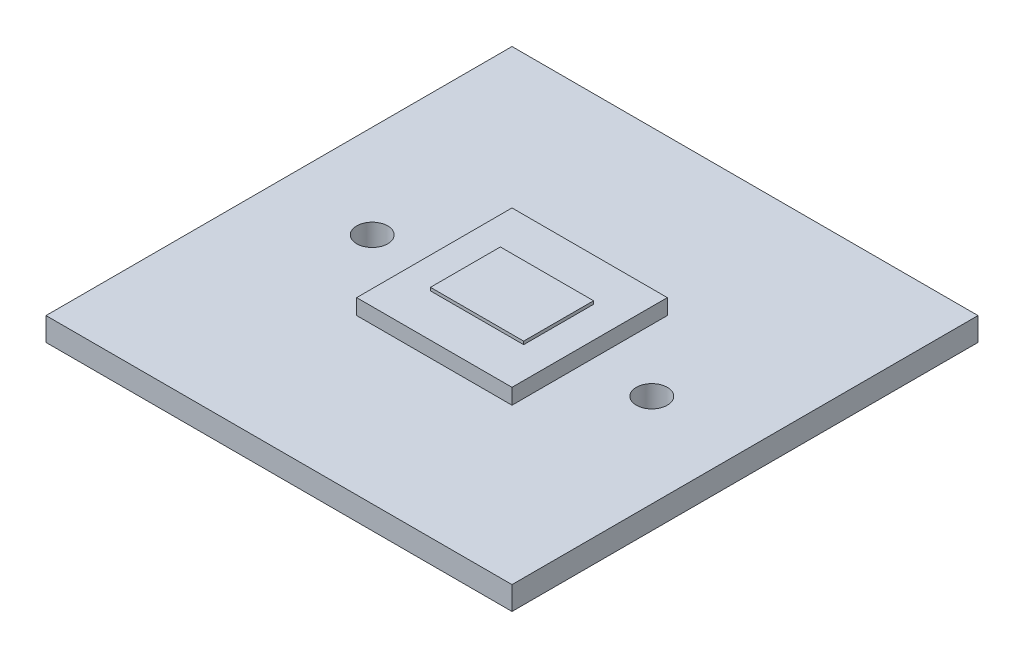
ISO-10303-21;
HEADER;
FILE_DESCRIPTION(('STEP AP214'),'2;1');
FILE_NAME('part.step','',(''),(''),'','','');
FILE_SCHEMA(('AUTOMOTIVE_DESIGN { 1 0 10303 214 1 1 1 1 }'));
ENDSEC;
DATA;
#1=APPLICATION_CONTEXT('core data for automotive mechanical design processes');
#2=APPLICATION_PROTOCOL_DEFINITION('international standard','automotive_design',2000,#1);
#3=PRODUCT_CONTEXT('',#1,'mechanical');
#4=PRODUCT('Part','Part','',(#3));
#5=PRODUCT_RELATED_PRODUCT_CATEGORY('part','',(#4));
#6=PRODUCT_DEFINITION_FORMATION('','',#4);
#7=PRODUCT_DEFINITION_CONTEXT('part definition',#1,'design');
#8=PRODUCT_DEFINITION('design','',#6,#7);
#9=PRODUCT_DEFINITION_SHAPE('','',#8);
#10=(LENGTH_UNIT() NAMED_UNIT(*) SI_UNIT(.MILLI.,.METRE.));
#11=(NAMED_UNIT(*) PLANE_ANGLE_UNIT() SI_UNIT($,.RADIAN.));
#12=(NAMED_UNIT(*) SI_UNIT($,.STERADIAN.) SOLID_ANGLE_UNIT());
#13=UNCERTAINTY_MEASURE_WITH_UNIT(LENGTH_MEASURE(1.E-05),#10,'distance_accuracy_value','');
#14=(GEOMETRIC_REPRESENTATION_CONTEXT(3) GLOBAL_UNCERTAINTY_ASSIGNED_CONTEXT((#13)) GLOBAL_UNIT_ASSIGNED_CONTEXT((#10,
#11,#12)) REPRESENTATION_CONTEXT('',''));
#15=CARTESIAN_POINT('',(0.,0.,0.));
#16=DIRECTION('',(0.,0.,1.));
#17=DIRECTION('',(1.,0.,0.));
#18=AXIS2_PLACEMENT_3D('',#15,#16,#17);
#19=CARTESIAN_POINT('',(0.,1.,0.));
#20=DIRECTION('',(0.,-1.,0.));
#21=DIRECTION('',(0.,0.,-1.));
#22=AXIS2_PLACEMENT_3D('',#19,#20,#21);
#23=PLANE('',#22);
#24=DIRECTION('',(0.,0.,-1.));
#25=VECTOR('',#24,1.);
#26=CARTESIAN_POINT('',(5.,1.,5.));
#27=LINE('',#26,#25);
#28=CARTESIAN_POINT('',(5.,1.,5.));
#29=VERTEX_POINT('',#28);
#30=CARTESIAN_POINT('',(5.,1.,-5.));
#31=VERTEX_POINT('',#30);
#32=EDGE_CURVE('E183',#29,#31,#27,.T.);
#33=ORIENTED_EDGE('',*,*,#32,.T.);
#34=DIRECTION('',(-1.,0.,0.));
#35=VECTOR('',#34,1.);
#36=CARTESIAN_POINT('',(-5.,1.,-5.));
#37=LINE('',#36,#35);
#38=CARTESIAN_POINT('',(-5.,1.,-5.));
#39=VERTEX_POINT('',#38);
#40=EDGE_CURVE('E186',#31,#39,#37,.T.);
#41=ORIENTED_EDGE('',*,*,#40,.T.);
#42=DIRECTION('',(0.,0.,1.));
#43=VECTOR('',#42,1.);
#44=CARTESIAN_POINT('',(-5.,1.,5.));
#45=LINE('',#44,#43);
#46=CARTESIAN_POINT('',(-5.,1.,5.));
#47=VERTEX_POINT('',#46);
#48=EDGE_CURVE('E189',#39,#47,#45,.T.);
#49=ORIENTED_EDGE('',*,*,#48,.T.);
#50=DIRECTION('',(1.,0.,0.));
#51=VECTOR('',#50,1.);
#52=CARTESIAN_POINT('',(-5.,1.,5.));
#53=LINE('',#52,#51);
#54=EDGE_CURVE('E191',#47,#29,#53,.T.);
#55=ORIENTED_EDGE('',*,*,#54,.T.);
#56=EDGE_LOOP('',(#33,#41,#49,#55));
#57=FACE_BOUND('',#56,.T.);
#58=DIRECTION('',(0.,0.,-1.));
#59=VECTOR('',#58,1.);
#60=CARTESIAN_POINT('',(3.,1.,2.25));
#61=LINE('',#60,#59);
#62=CARTESIAN_POINT('',(3.,1.,2.25));
#63=VERTEX_POINT('',#62);
#64=CARTESIAN_POINT('',(3.,1.,-2.25));
#65=VERTEX_POINT('',#64);
#66=EDGE_CURVE('E149',#63,#65,#61,.T.);
#67=ORIENTED_EDGE('',*,*,#66,.F.);
#68=DIRECTION('',(1.,0.,0.));
#69=VECTOR('',#68,1.);
#70=CARTESIAN_POINT('',(-3.,1.,2.25));
#71=LINE('',#70,#69);
#72=CARTESIAN_POINT('',(-3.,1.,2.25));
#73=VERTEX_POINT('',#72);
#74=EDGE_CURVE('E161',#73,#63,#71,.T.);
#75=ORIENTED_EDGE('',*,*,#74,.F.);
#76=DIRECTION('',(0.,0.,1.));
#77=VECTOR('',#76,1.);
#78=CARTESIAN_POINT('',(-3.,1.,2.25));
#79=LINE('',#78,#77);
#80=CARTESIAN_POINT('',(-3.,1.,-2.25));
#81=VERTEX_POINT('',#80);
#82=EDGE_CURVE('E57',#81,#73,#79,.T.);
#83=ORIENTED_EDGE('',*,*,#82,.F.);
#84=DIRECTION('',(-1.,0.,0.));
#85=VECTOR('',#84,1.);
#86=CARTESIAN_POINT('',(-3.,1.,-2.25));
#87=LINE('',#86,#85);
#88=EDGE_CURVE('E52',#65,#81,#87,.T.);
#89=ORIENTED_EDGE('',*,*,#88,.F.);
#90=EDGE_LOOP('',(#67,#75,#83,#89));
#91=FACE_BOUND('',#90,.T.);
#92=ADVANCED_FACE('F37',(#57,#91),#23,.F.);
#93=CARTESIAN_POINT('',(5.,1.,5.));
#94=DIRECTION('',(-1.,0.,0.));
#95=DIRECTION('',(0.,0.,1.));
#96=AXIS2_PLACEMENT_3D('',#93,#94,#95);
#97=PLANE('',#96);
#98=DIRECTION('',(0.,0.,-1.));
#99=VECTOR('',#98,1.);
#100=CARTESIAN_POINT('',(5.,0.,5.));
#101=LINE('',#100,#99);
#102=CARTESIAN_POINT('',(5.,0.,5.));
#103=VERTEX_POINT('',#102);
#104=CARTESIAN_POINT('',(5.,0.,-5.));
#105=VERTEX_POINT('',#104);
#106=EDGE_CURVE('E182',#103,#105,#101,.T.);
#107=ORIENTED_EDGE('',*,*,#106,.T.);
#108=DIRECTION('',(0.,-1.,0.));
#109=VECTOR('',#108,1.);
#110=CARTESIAN_POINT('',(5.,1.,-5.));
#111=LINE('',#110,#109);
#112=EDGE_CURVE('E11',#31,#105,#111,.T.);
#113=ORIENTED_EDGE('',*,*,#112,.F.);
#114=ORIENTED_EDGE('',*,*,#32,.F.);
#115=DIRECTION('',(0.,-1.,0.));
#116=VECTOR('',#115,1.);
#117=CARTESIAN_POINT('',(5.,1.,5.));
#118=LINE('',#117,#116);
#119=EDGE_CURVE('E193',#29,#103,#118,.T.);
#120=ORIENTED_EDGE('',*,*,#119,.T.);
#121=EDGE_LOOP('',(#107,#113,#114,#120));
#122=FACE_BOUND('',#121,.T.);
#123=ADVANCED_FACE('F39',(#122),#97,.F.);
#124=CARTESIAN_POINT('',(-5.,1.,-5.));
#125=DIRECTION('',(0.,0.,1.));
#126=DIRECTION('',(1.,0.,0.));
#127=AXIS2_PLACEMENT_3D('',#124,#125,#126);
#128=PLANE('',#127);
#129=DIRECTION('',(-1.,0.,0.));
#130=VECTOR('',#129,1.);
#131=CARTESIAN_POINT('',(-5.,0.,-5.));
#132=LINE('',#131,#130);
#133=CARTESIAN_POINT('',(-5.,0.,-5.));
#134=VERTEX_POINT('',#133);
#135=EDGE_CURVE('E196',#105,#134,#132,.T.);
#136=ORIENTED_EDGE('',*,*,#135,.T.);
#137=DIRECTION('',(0.,-1.,0.));
#138=VECTOR('',#137,1.);
#139=CARTESIAN_POINT('',(-5.,1.,-5.));
#140=LINE('',#139,#138);
#141=EDGE_CURVE('E45',#39,#134,#140,.T.);
#142=ORIENTED_EDGE('',*,*,#141,.F.);
#143=ORIENTED_EDGE('',*,*,#40,.F.);
#144=ORIENTED_EDGE('',*,*,#112,.T.);
#145=EDGE_LOOP('',(#136,#142,#143,#144));
#146=FACE_BOUND('',#145,.T.);
#147=ADVANCED_FACE('F215',(#146),#128,.F.);
#148=CARTESIAN_POINT('',(-5.,1.,5.));
#149=DIRECTION('',(1.,0.,0.));
#150=DIRECTION('',(0.,0.,-1.));
#151=AXIS2_PLACEMENT_3D('',#148,#149,#150);
#152=PLANE('',#151);
#153=DIRECTION('',(0.,0.,1.));
#154=VECTOR('',#153,1.);
#155=CARTESIAN_POINT('',(-5.,0.,5.));
#156=LINE('',#155,#154);
#157=CARTESIAN_POINT('',(-5.,0.,5.));
#158=VERTEX_POINT('',#157);
#159=EDGE_CURVE('E199',#134,#158,#156,.T.);
#160=ORIENTED_EDGE('',*,*,#159,.T.);
#161=DIRECTION('',(0.,-1.,0.));
#162=VECTOR('',#161,1.);
#163=CARTESIAN_POINT('',(-5.,1.,5.));
#164=LINE('',#163,#162);
#165=EDGE_CURVE('E206',#47,#158,#164,.T.);
#166=ORIENTED_EDGE('',*,*,#165,.F.);
#167=ORIENTED_EDGE('',*,*,#48,.F.);
#168=ORIENTED_EDGE('',*,*,#141,.T.);
#169=EDGE_LOOP('',(#160,#166,#167,#168));
#170=FACE_BOUND('',#169,.T.);
#171=ADVANCED_FACE('F212',(#170),#152,.F.);
#172=CARTESIAN_POINT('',(-5.,1.,5.));
#173=DIRECTION('',(0.,0.,-1.));
#174=DIRECTION('',(-1.,0.,0.));
#175=AXIS2_PLACEMENT_3D('',#172,#173,#174);
#176=PLANE('',#175);
#177=DIRECTION('',(1.,0.,0.));
#178=VECTOR('',#177,1.);
#179=CARTESIAN_POINT('',(-5.,0.,5.));
#180=LINE('',#179,#178);
#181=EDGE_CURVE('E187',#158,#103,#180,.T.);
#182=ORIENTED_EDGE('',*,*,#181,.T.);
#183=ORIENTED_EDGE('',*,*,#119,.F.);
#184=ORIENTED_EDGE('',*,*,#54,.F.);
#185=ORIENTED_EDGE('',*,*,#165,.T.);
#186=EDGE_LOOP('',(#182,#183,#184,#185));
#187=FACE_BOUND('',#186,.T.);
#188=ADVANCED_FACE('F221',(#187),#176,.F.);
#189=CARTESIAN_POINT('',(3.,1.2,2.25));
#190=DIRECTION('',(-1.,0.,0.));
#191=DIRECTION('',(0.,0.,1.));
#192=AXIS2_PLACEMENT_3D('',#189,#190,#191);
#193=PLANE('',#192);
#194=ORIENTED_EDGE('',*,*,#66,.T.);
#195=DIRECTION('',(0.,-1.,0.));
#196=VECTOR('',#195,1.);
#197=CARTESIAN_POINT('',(3.,1.2,-2.25));
#198=LINE('',#197,#196);
#199=CARTESIAN_POINT('',(3.,1.2,-2.25));
#200=VERTEX_POINT('',#199);
#201=EDGE_CURVE('E180',#200,#65,#198,.T.);
#202=ORIENTED_EDGE('',*,*,#201,.F.);
#203=DIRECTION('',(0.,0.,-1.));
#204=VECTOR('',#203,1.);
#205=CARTESIAN_POINT('',(3.,1.2,2.25));
#206=LINE('',#205,#204);
#207=CARTESIAN_POINT('',(3.,1.2,2.25));
#208=VERTEX_POINT('',#207);
#209=EDGE_CURVE('E157',#208,#200,#206,.T.);
#210=ORIENTED_EDGE('',*,*,#209,.F.);
#211=DIRECTION('',(0.,-1.,0.));
#212=VECTOR('',#211,1.);
#213=CARTESIAN_POINT('',(3.,1.2,2.25));
#214=LINE('',#213,#212);
#215=EDGE_CURVE('E166',#208,#63,#214,.T.);
#216=ORIENTED_EDGE('',*,*,#215,.T.);
#217=EDGE_LOOP('',(#194,#202,#210,#216));
#218=FACE_BOUND('',#217,.T.);
#219=ADVANCED_FACE('F236',(#218),#193,.F.);
#220=CARTESIAN_POINT('',(-3.,1.2,-2.25));
#221=DIRECTION('',(0.,0.,1.));
#222=DIRECTION('',(1.,0.,0.));
#223=AXIS2_PLACEMENT_3D('',#220,#221,#222);
#224=PLANE('',#223);
#225=ORIENTED_EDGE('',*,*,#88,.T.);
#226=DIRECTION('',(0.,-1.,0.));
#227=VECTOR('',#226,1.);
#228=CARTESIAN_POINT('',(-3.,1.2,-2.25));
#229=LINE('',#228,#227);
#230=CARTESIAN_POINT('',(-3.,1.2,-2.25));
#231=VERTEX_POINT('',#230);
#232=EDGE_CURVE('E177',#231,#81,#229,.T.);
#233=ORIENTED_EDGE('',*,*,#232,.F.);
#234=DIRECTION('',(-1.,0.,0.));
#235=VECTOR('',#234,1.);
#236=CARTESIAN_POINT('',(-3.,1.2,-2.25));
#237=LINE('',#236,#235);
#238=EDGE_CURVE('E160',#200,#231,#237,.T.);
#239=ORIENTED_EDGE('',*,*,#238,.F.);
#240=ORIENTED_EDGE('',*,*,#201,.T.);
#241=EDGE_LOOP('',(#225,#233,#239,#240));
#242=FACE_BOUND('',#241,.T.);
#243=ADVANCED_FACE('F244',(#242),#224,.F.);
#244=CARTESIAN_POINT('',(-3.,1.2,2.25));
#245=DIRECTION('',(1.,0.,0.));
#246=DIRECTION('',(0.,0.,-1.));
#247=AXIS2_PLACEMENT_3D('',#244,#245,#246);
#248=PLANE('',#247);
#249=ORIENTED_EDGE('',*,*,#82,.T.);
#250=DIRECTION('',(0.,-1.,0.));
#251=VECTOR('',#250,1.);
#252=CARTESIAN_POINT('',(-3.,1.2,2.25));
#253=LINE('',#252,#251);
#254=CARTESIAN_POINT('',(-3.,1.2,2.25));
#255=VERTEX_POINT('',#254);
#256=EDGE_CURVE('E174',#255,#73,#253,.T.);
#257=ORIENTED_EDGE('',*,*,#256,.F.);
#258=DIRECTION('',(0.,0.,1.));
#259=VECTOR('',#258,1.);
#260=CARTESIAN_POINT('',(-3.,1.2,2.25));
#261=LINE('',#260,#259);
#262=EDGE_CURVE('E163',#231,#255,#261,.T.);
#263=ORIENTED_EDGE('',*,*,#262,.F.);
#264=ORIENTED_EDGE('',*,*,#232,.T.);
#265=EDGE_LOOP('',(#249,#257,#263,#264));
#266=FACE_BOUND('',#265,.T.);
#267=ADVANCED_FACE('F242',(#266),#248,.F.);
#268=CARTESIAN_POINT('',(-3.,1.2,2.25));
#269=DIRECTION('',(0.,0.,-1.));
#270=DIRECTION('',(-1.,0.,0.));
#271=AXIS2_PLACEMENT_3D('',#268,#269,#270);
#272=PLANE('',#271);
#273=ORIENTED_EDGE('',*,*,#74,.T.);
#274=ORIENTED_EDGE('',*,*,#215,.F.);
#275=DIRECTION('',(1.,0.,0.));
#276=VECTOR('',#275,1.);
#277=CARTESIAN_POINT('',(-3.,1.2,2.25));
#278=LINE('',#277,#276);
#279=EDGE_CURVE('E165',#255,#208,#278,.T.);
#280=ORIENTED_EDGE('',*,*,#279,.F.);
#281=ORIENTED_EDGE('',*,*,#256,.T.);
#282=EDGE_LOOP('',(#273,#274,#280,#281));
#283=FACE_BOUND('',#282,.T.);
#284=ADVANCED_FACE('F232',(#283),#272,.F.);
#285=CARTESIAN_POINT('',(0.,1.2,0.));
#286=DIRECTION('',(0.,-1.,0.));
#287=DIRECTION('',(0.,0.,-1.));
#288=AXIS2_PLACEMENT_3D('',#285,#286,#287);
#289=PLANE('',#288);
#290=ORIENTED_EDGE('',*,*,#209,.T.);
#291=ORIENTED_EDGE('',*,*,#238,.T.);
#292=ORIENTED_EDGE('',*,*,#262,.T.);
#293=ORIENTED_EDGE('',*,*,#279,.T.);
#294=EDGE_LOOP('',(#290,#291,#292,#293));
#295=FACE_BOUND('',#294,.T.);
#296=ADVANCED_FACE('F238',(#295),#289,.F.);
#297=CARTESIAN_POINT('',(0.,0.,0.));
#298=DIRECTION('',(0.,-1.,0.));
#299=DIRECTION('',(0.,0.,-1.));
#300=AXIS2_PLACEMENT_3D('',#297,#298,#299);
#301=PLANE('',#300);
#302=CARTESIAN_POINT('',(-9.,0.,0.));
#303=DIRECTION('',(0.,1.,0.));
#304=DIRECTION('',(0.,0.,1.));
#305=AXIS2_PLACEMENT_3D('',#302,#303,#304);
#306=CIRCLE('',#305,1.);
#307=CARTESIAN_POINT('',(-9.,0.,1.));
#308=VERTEX_POINT('',#307);
#309=EDGE_CURVE('E409',#308,#308,#306,.T.);
#310=ORIENTED_EDGE('',*,*,#309,.F.);
#311=EDGE_LOOP('',(#310));
#312=FACE_BOUND('',#311,.T.);
#313=CARTESIAN_POINT('',(9.,0.,0.));
#314=DIRECTION('',(0.,1.,0.));
#315=DIRECTION('',(0.,0.,1.));
#316=AXIS2_PLACEMENT_3D('',#313,#314,#315);
#317=CIRCLE('',#316,1.);
#318=CARTESIAN_POINT('',(9.,0.,1.));
#319=VERTEX_POINT('',#318);
#320=EDGE_CURVE('E411',#319,#319,#317,.T.);
#321=ORIENTED_EDGE('',*,*,#320,.F.);
#322=EDGE_LOOP('',(#321));
#323=FACE_BOUND('',#322,.T.);
#324=DIRECTION('',(0.,0.,1.));
#325=VECTOR('',#324,1.);
#326=CARTESIAN_POINT('',(15.,0.,15.));
#327=LINE('',#326,#325);
#328=CARTESIAN_POINT('',(15.,0.,-15.));
#329=VERTEX_POINT('',#328);
#330=CARTESIAN_POINT('',(15.,0.,15.));
#331=VERTEX_POINT('',#330);
#332=EDGE_CURVE('E148',#329,#331,#327,.T.);
#333=ORIENTED_EDGE('',*,*,#332,.F.);
#334=DIRECTION('',(1.,0.,0.));
#335=VECTOR('',#334,1.);
#336=CARTESIAN_POINT('',(-15.,0.,-15.));
#337=LINE('',#336,#335);
#338=CARTESIAN_POINT('',(-15.,0.,-15.));
#339=VERTEX_POINT('',#338);
#340=EDGE_CURVE('E144',#339,#329,#337,.T.);
#341=ORIENTED_EDGE('',*,*,#340,.F.);
#342=DIRECTION('',(0.,0.,-1.));
#343=VECTOR('',#342,1.);
#344=CARTESIAN_POINT('',(-15.,0.,15.));
#345=LINE('',#344,#343);
#346=CARTESIAN_POINT('',(-15.,0.,15.));
#347=VERTEX_POINT('',#346);
#348=EDGE_CURVE('E425',#347,#339,#345,.T.);
#349=ORIENTED_EDGE('',*,*,#348,.F.);
#350=DIRECTION('',(-1.,0.,0.));
#351=VECTOR('',#350,1.);
#352=CARTESIAN_POINT('',(-15.,0.,15.));
#353=LINE('',#352,#351);
#354=EDGE_CURVE('E423',#331,#347,#353,.T.);
#355=ORIENTED_EDGE('',*,*,#354,.F.);
#356=EDGE_LOOP('',(#333,#341,#349,#355));
#357=FACE_BOUND('',#356,.T.);
#358=ORIENTED_EDGE('',*,*,#135,.F.);
#359=ORIENTED_EDGE('',*,*,#106,.F.);
#360=ORIENTED_EDGE('',*,*,#181,.F.);
#361=ORIENTED_EDGE('',*,*,#159,.F.);
#362=EDGE_LOOP('',(#358,#359,#360,#361));
#363=FACE_BOUND('',#362,.T.);
#364=ADVANCED_FACE('F218',(#312,#323,#357,#363),#301,.F.);
#365=CARTESIAN_POINT('',(15.,-1.5,15.));
#366=DIRECTION('',(-1.,0.,0.));
#367=DIRECTION('',(0.,0.,1.));
#368=AXIS2_PLACEMENT_3D('',#365,#366,#367);
#369=PLANE('',#368);
#370=ORIENTED_EDGE('',*,*,#332,.T.);
#371=DIRECTION('',(0.,1.,0.));
#372=VECTOR('',#371,1.);
#373=CARTESIAN_POINT('',(15.,-1.5,15.));
#374=LINE('',#373,#372);
#375=CARTESIAN_POINT('',(15.,-1.5,15.));
#376=VERTEX_POINT('',#375);
#377=EDGE_CURVE('E128',#376,#331,#374,.T.);
#378=ORIENTED_EDGE('',*,*,#377,.F.);
#379=DIRECTION('',(0.,0.,1.));
#380=VECTOR('',#379,1.);
#381=CARTESIAN_POINT('',(15.,-1.5,15.));
#382=LINE('',#381,#380);
#383=CARTESIAN_POINT('',(15.,-1.5,-15.));
#384=VERTEX_POINT('',#383);
#385=EDGE_CURVE('E135',#384,#376,#382,.T.);
#386=ORIENTED_EDGE('',*,*,#385,.F.);
#387=DIRECTION('',(0.,1.,0.));
#388=VECTOR('',#387,1.);
#389=CARTESIAN_POINT('',(15.,-1.5,-15.));
#390=LINE('',#389,#388);
#391=EDGE_CURVE('E421',#384,#329,#390,.T.);
#392=ORIENTED_EDGE('',*,*,#391,.T.);
#393=EDGE_LOOP('',(#370,#378,#386,#392));
#394=FACE_BOUND('',#393,.T.);
#395=ADVANCED_FACE('F146',(#394),#369,.F.);
#396=CARTESIAN_POINT('',(-15.,-1.5,15.));
#397=DIRECTION('',(0.,0.,-1.));
#398=DIRECTION('',(-1.,0.,0.));
#399=AXIS2_PLACEMENT_3D('',#396,#397,#398);
#400=PLANE('',#399);
#401=ORIENTED_EDGE('',*,*,#354,.T.);
#402=DIRECTION('',(0.,1.,0.));
#403=VECTOR('',#402,1.);
#404=CARTESIAN_POINT('',(-15.,-1.5,15.));
#405=LINE('',#404,#403);
#406=CARTESIAN_POINT('',(-15.,-1.5,15.));
#407=VERTEX_POINT('',#406);
#408=EDGE_CURVE('E131',#407,#347,#405,.T.);
#409=ORIENTED_EDGE('',*,*,#408,.F.);
#410=DIRECTION('',(-1.,0.,0.));
#411=VECTOR('',#410,1.);
#412=CARTESIAN_POINT('',(-15.,-1.5,15.));
#413=LINE('',#412,#411);
#414=EDGE_CURVE('E124',#376,#407,#413,.T.);
#415=ORIENTED_EDGE('',*,*,#414,.F.);
#416=ORIENTED_EDGE('',*,*,#377,.T.);
#417=EDGE_LOOP('',(#401,#409,#415,#416));
#418=FACE_BOUND('',#417,.T.);
#419=ADVANCED_FACE('F126',(#418),#400,.F.);
#420=CARTESIAN_POINT('',(-15.,-1.5,15.));
#421=DIRECTION('',(1.,0.,0.));
#422=DIRECTION('',(0.,0.,-1.));
#423=AXIS2_PLACEMENT_3D('',#420,#421,#422);
#424=PLANE('',#423);
#425=ORIENTED_EDGE('',*,*,#348,.T.);
#426=DIRECTION('',(0.,1.,0.));
#427=VECTOR('',#426,1.);
#428=CARTESIAN_POINT('',(-15.,-1.5,-15.));
#429=LINE('',#428,#427);
#430=CARTESIAN_POINT('',(-15.,-1.5,-15.));
#431=VERTEX_POINT('',#430);
#432=EDGE_CURVE('E153',#431,#339,#429,.T.);
#433=ORIENTED_EDGE('',*,*,#432,.F.);
#434=DIRECTION('',(0.,0.,-1.));
#435=VECTOR('',#434,1.);
#436=CARTESIAN_POINT('',(-15.,-1.5,15.));
#437=LINE('',#436,#435);
#438=EDGE_CURVE('E134',#407,#431,#437,.T.);
#439=ORIENTED_EDGE('',*,*,#438,.F.);
#440=ORIENTED_EDGE('',*,*,#408,.T.);
#441=EDGE_LOOP('',(#425,#433,#439,#440));
#442=FACE_BOUND('',#441,.T.);
#443=ADVANCED_FACE('F311',(#442),#424,.F.);
#444=CARTESIAN_POINT('',(-15.,-1.5,-15.));
#445=DIRECTION('',(0.,0.,1.));
#446=DIRECTION('',(1.,0.,0.));
#447=AXIS2_PLACEMENT_3D('',#444,#445,#446);
#448=PLANE('',#447);
#449=ORIENTED_EDGE('',*,*,#340,.T.);
#450=ORIENTED_EDGE('',*,*,#391,.F.);
#451=DIRECTION('',(1.,0.,0.));
#452=VECTOR('',#451,1.);
#453=CARTESIAN_POINT('',(-15.,-1.5,-15.));
#454=LINE('',#453,#452);
#455=EDGE_CURVE('E140',#431,#384,#454,.T.);
#456=ORIENTED_EDGE('',*,*,#455,.F.);
#457=ORIENTED_EDGE('',*,*,#432,.T.);
#458=EDGE_LOOP('',(#449,#450,#456,#457));
#459=FACE_BOUND('',#458,.T.);
#460=ADVANCED_FACE('F318',(#459),#448,.F.);
#461=CARTESIAN_POINT('',(0.,-1.5,0.));
#462=DIRECTION('',(0.,-1.,0.));
#463=DIRECTION('',(0.,0.,-1.));
#464=AXIS2_PLACEMENT_3D('',#461,#462,#463);
#465=PLANE('',#464);
#466=CARTESIAN_POINT('',(-9.,-1.5,0.));
#467=DIRECTION('',(0.,1.,0.));
#468=DIRECTION('',(0.,0.,1.));
#469=AXIS2_PLACEMENT_3D('',#466,#467,#468);
#470=CIRCLE('',#469,1.);
#471=CARTESIAN_POINT('',(-9.,-1.5,1.));
#472=VERTEX_POINT('',#471);
#473=EDGE_CURVE('E406',#472,#472,#470,.T.);
#474=ORIENTED_EDGE('',*,*,#473,.T.);
#475=EDGE_LOOP('',(#474));
#476=FACE_BOUND('',#475,.T.);
#477=CARTESIAN_POINT('',(9.,-1.5,0.));
#478=DIRECTION('',(0.,1.,0.));
#479=DIRECTION('',(0.,0.,1.));
#480=AXIS2_PLACEMENT_3D('',#477,#478,#479);
#481=CIRCLE('',#480,1.);
#482=CARTESIAN_POINT('',(9.,-1.5,1.));
#483=VERTEX_POINT('',#482);
#484=EDGE_CURVE('E414',#483,#483,#481,.T.);
#485=ORIENTED_EDGE('',*,*,#484,.T.);
#486=EDGE_LOOP('',(#485));
#487=FACE_BOUND('',#486,.T.);
#488=ORIENTED_EDGE('',*,*,#385,.T.);
#489=ORIENTED_EDGE('',*,*,#414,.T.);
#490=ORIENTED_EDGE('',*,*,#438,.T.);
#491=ORIENTED_EDGE('',*,*,#455,.T.);
#492=EDGE_LOOP('',(#488,#489,#490,#491));
#493=FACE_BOUND('',#492,.T.);
#494=ADVANCED_FACE('F138',(#476,#487,#493),#465,.T.);
#495=CARTESIAN_POINT('',(9.,-1.5,0.));
#496=DIRECTION('',(0.,1.,0.));
#497=DIRECTION('',(0.,0.,1.));
#498=AXIS2_PLACEMENT_3D('',#495,#496,#497);
#499=CYLINDRICAL_SURFACE('',#498,1.);
#500=ORIENTED_EDGE('',*,*,#484,.F.);
#501=EDGE_LOOP('',(#500));
#502=FACE_BOUND('',#501,.T.);
#503=ORIENTED_EDGE('',*,*,#320,.T.);
#504=EDGE_LOOP('',(#503));
#505=FACE_BOUND('',#504,.T.);
#506=ADVANCED_FACE('F331',(#502,#505),#499,.F.);
#507=CARTESIAN_POINT('',(-9.,-1.5,0.));
#508=DIRECTION('',(0.,1.,0.));
#509=DIRECTION('',(0.,0.,1.));
#510=AXIS2_PLACEMENT_3D('',#507,#508,#509);
#511=CYLINDRICAL_SURFACE('',#510,1.);
#512=ORIENTED_EDGE('',*,*,#473,.F.);
#513=EDGE_LOOP('',(#512));
#514=FACE_BOUND('',#513,.T.);
#515=ORIENTED_EDGE('',*,*,#309,.T.);
#516=EDGE_LOOP('',(#515));
#517=FACE_BOUND('',#516,.T.);
#518=ADVANCED_FACE('F339',(#514,#517),#511,.F.);
#519=CLOSED_SHELL('',(#92,#123,#147,#171,#188,#219,#243,#267,#284,#296,#364,#395,#419,#443,#460,
#494,#506,#518));
#520=MANIFOLD_SOLID_BREP('B2',#519);
#521=ADVANCED_BREP_SHAPE_REPRESENTATION('',(#18,#520),#14);
#522=SHAPE_DEFINITION_REPRESENTATION(#9,#521);
ENDSEC;
END-ISO-10303-21;
